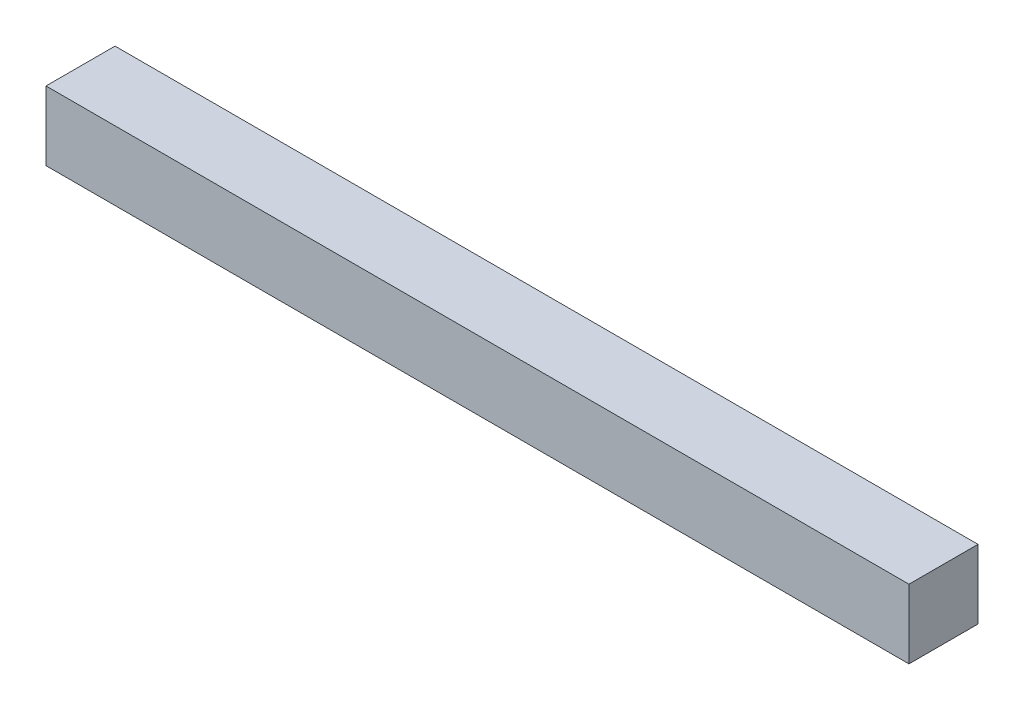
ISO-10303-21;
HEADER;
FILE_DESCRIPTION(('STEP AP214'),'2;1');
FILE_NAME('part.step','',(''),(''),'','','');
FILE_SCHEMA(('AUTOMOTIVE_DESIGN { 1 0 10303 214 1 1 1 1 }'));
ENDSEC;
DATA;
#1=APPLICATION_CONTEXT('core data for automotive mechanical design processes');
#2=APPLICATION_PROTOCOL_DEFINITION('international standard','automotive_design',2000,#1);
#3=PRODUCT_CONTEXT('',#1,'mechanical');
#4=PRODUCT('Part','Part','',(#3));
#5=PRODUCT_RELATED_PRODUCT_CATEGORY('part','',(#4));
#6=PRODUCT_DEFINITION_FORMATION('','',#4);
#7=PRODUCT_DEFINITION_CONTEXT('part definition',#1,'design');
#8=PRODUCT_DEFINITION('design','',#6,#7);
#9=PRODUCT_DEFINITION_SHAPE('','',#8);
#10=(LENGTH_UNIT() NAMED_UNIT(*) SI_UNIT(.MILLI.,.METRE.));
#11=(NAMED_UNIT(*) PLANE_ANGLE_UNIT() SI_UNIT($,.RADIAN.));
#12=(NAMED_UNIT(*) SI_UNIT($,.STERADIAN.) SOLID_ANGLE_UNIT());
#13=UNCERTAINTY_MEASURE_WITH_UNIT(LENGTH_MEASURE(1.E-05),#10,'distance_accuracy_value','');
#14=(GEOMETRIC_REPRESENTATION_CONTEXT(3) GLOBAL_UNCERTAINTY_ASSIGNED_CONTEXT((#13)) GLOBAL_UNIT_ASSIGNED_CONTEXT((#10,
#11,#12)) REPRESENTATION_CONTEXT('',''));
#15=CARTESIAN_POINT('',(0.,0.,0.));
#16=DIRECTION('',(0.,0.,1.));
#17=DIRECTION('',(1.,0.,0.));
#18=AXIS2_PLACEMENT_3D('',#15,#16,#17);
#19=CARTESIAN_POINT('',(0.,0.,16.));
#20=DIRECTION('',(1.,0.,0.));
#21=DIRECTION('',(0.,0.,-1.));
#22=AXIS2_PLACEMENT_3D('',#19,#20,#21);
#23=PLANE('',#22);
#24=DIRECTION('',(0.,-1.,0.));
#25=VECTOR('',#24,1.);
#26=CARTESIAN_POINT('',(0.,0.,0.));
#27=LINE('',#26,#25);
#28=CARTESIAN_POINT('',(0.,16.,0.));
#29=VERTEX_POINT('',#28);
#30=CARTESIAN_POINT('',(0.,0.,0.));
#31=VERTEX_POINT('',#30);
#32=EDGE_CURVE('E96',#29,#31,#27,.T.);
#33=ORIENTED_EDGE('',*,*,#32,.T.);
#34=DIRECTION('',(0.,0.,-1.));
#35=VECTOR('',#34,1.);
#36=CARTESIAN_POINT('',(0.,0.,16.));
#37=LINE('',#36,#35);
#38=CARTESIAN_POINT('',(0.,0.,16.));
#39=VERTEX_POINT('',#38);
#40=EDGE_CURVE('E11',#39,#31,#37,.T.);
#41=ORIENTED_EDGE('',*,*,#40,.F.);
#42=DIRECTION('',(0.,-1.,0.));
#43=VECTOR('',#42,1.);
#44=CARTESIAN_POINT('',(0.,0.,16.));
#45=LINE('',#44,#43);
#46=CARTESIAN_POINT('',(0.,16.,16.));
#47=VERTEX_POINT('',#46);
#48=EDGE_CURVE('E84',#47,#39,#45,.T.);
#49=ORIENTED_EDGE('',*,*,#48,.F.);
#50=DIRECTION('',(0.,0.,-1.));
#51=VECTOR('',#50,1.);
#52=CARTESIAN_POINT('',(0.,16.,16.));
#53=LINE('',#52,#51);
#54=EDGE_CURVE('E92',#47,#29,#53,.T.);
#55=ORIENTED_EDGE('',*,*,#54,.T.);
#56=EDGE_LOOP('',(#33,#41,#49,#55));
#57=FACE_BOUND('',#56,.T.);
#58=ADVANCED_FACE('F33',(#57),#23,.F.);
#59=CARTESIAN_POINT('',(0.,0.,16.));
#60=DIRECTION('',(0.,1.,0.));
#61=DIRECTION('',(0.,0.,1.));
#62=AXIS2_PLACEMENT_3D('',#59,#60,#61);
#63=PLANE('',#62);
#64=DIRECTION('',(1.,0.,0.));
#65=VECTOR('',#64,1.);
#66=CARTESIAN_POINT('',(0.,0.,0.));
#67=LINE('',#66,#65);
#68=CARTESIAN_POINT('',(200.,0.,0.));
#69=VERTEX_POINT('',#68);
#70=EDGE_CURVE('E88',#31,#69,#67,.T.);
#71=ORIENTED_EDGE('',*,*,#70,.T.);
#72=DIRECTION('',(0.,0.,-1.));
#73=VECTOR('',#72,1.);
#74=CARTESIAN_POINT('',(200.,0.,16.));
#75=LINE('',#74,#73);
#76=CARTESIAN_POINT('',(200.,0.,16.));
#77=VERTEX_POINT('',#76);
#78=EDGE_CURVE('E41',#77,#69,#75,.T.);
#79=ORIENTED_EDGE('',*,*,#78,.F.);
#80=DIRECTION('',(1.,0.,0.));
#81=VECTOR('',#80,1.);
#82=CARTESIAN_POINT('',(0.,0.,16.));
#83=LINE('',#82,#81);
#84=EDGE_CURVE('E79',#39,#77,#83,.T.);
#85=ORIENTED_EDGE('',*,*,#84,.F.);
#86=ORIENTED_EDGE('',*,*,#40,.T.);
#87=EDGE_LOOP('',(#71,#79,#85,#86));
#88=FACE_BOUND('',#87,.T.);
#89=ADVANCED_FACE('F87',(#88),#63,.F.);
#90=CARTESIAN_POINT('',(200.,0.,16.));
#91=DIRECTION('',(-1.,0.,0.));
#92=DIRECTION('',(0.,0.,1.));
#93=AXIS2_PLACEMENT_3D('',#90,#91,#92);
#94=PLANE('',#93);
#95=DIRECTION('',(0.,1.,0.));
#96=VECTOR('',#95,1.);
#97=CARTESIAN_POINT('',(200.,0.,0.));
#98=LINE('',#97,#96);
#99=CARTESIAN_POINT('',(200.,16.,0.));
#100=VERTEX_POINT('',#99);
#101=EDGE_CURVE('E66',#69,#100,#98,.T.);
#102=ORIENTED_EDGE('',*,*,#101,.T.);
#103=DIRECTION('',(0.,0.,-1.));
#104=VECTOR('',#103,1.);
#105=CARTESIAN_POINT('',(200.,16.,16.));
#106=LINE('',#105,#104);
#107=CARTESIAN_POINT('',(200.,16.,16.));
#108=VERTEX_POINT('',#107);
#109=EDGE_CURVE('E89',#108,#100,#106,.T.);
#110=ORIENTED_EDGE('',*,*,#109,.F.);
#111=DIRECTION('',(0.,1.,0.));
#112=VECTOR('',#111,1.);
#113=CARTESIAN_POINT('',(200.,0.,16.));
#114=LINE('',#113,#112);
#115=EDGE_CURVE('E82',#77,#108,#114,.T.);
#116=ORIENTED_EDGE('',*,*,#115,.F.);
#117=ORIENTED_EDGE('',*,*,#78,.T.);
#118=EDGE_LOOP('',(#102,#110,#116,#117));
#119=FACE_BOUND('',#118,.T.);
#120=ADVANCED_FACE('F90',(#119),#94,.F.);
#121=CARTESIAN_POINT('',(0.,16.,16.));
#122=DIRECTION('',(0.,-1.,0.));
#123=DIRECTION('',(0.,0.,-1.));
#124=AXIS2_PLACEMENT_3D('',#121,#122,#123);
#125=PLANE('',#124);
#126=DIRECTION('',(-1.,0.,0.));
#127=VECTOR('',#126,1.);
#128=CARTESIAN_POINT('',(0.,16.,0.));
#129=LINE('',#128,#127);
#130=EDGE_CURVE('E72',#100,#29,#129,.T.);
#131=ORIENTED_EDGE('',*,*,#130,.T.);
#132=ORIENTED_EDGE('',*,*,#54,.F.);
#133=DIRECTION('',(-1.,0.,0.));
#134=VECTOR('',#133,1.);
#135=CARTESIAN_POINT('',(0.,16.,16.));
#136=LINE('',#135,#134);
#137=EDGE_CURVE('E49',#108,#47,#136,.T.);
#138=ORIENTED_EDGE('',*,*,#137,.F.);
#139=ORIENTED_EDGE('',*,*,#109,.T.);
#140=EDGE_LOOP('',(#131,#132,#138,#139));
#141=FACE_BOUND('',#140,.T.);
#142=ADVANCED_FACE('F103',(#141),#125,.F.);
#143=CARTESIAN_POINT('',(0.,0.,16.));
#144=DIRECTION('',(0.,0.,-1.));
#145=DIRECTION('',(-1.,0.,0.));
#146=AXIS2_PLACEMENT_3D('',#143,#144,#145);
#147=PLANE('',#146);
#148=ORIENTED_EDGE('',*,*,#48,.T.);
#149=ORIENTED_EDGE('',*,*,#84,.T.);
#150=ORIENTED_EDGE('',*,*,#115,.T.);
#151=ORIENTED_EDGE('',*,*,#137,.T.);
#152=EDGE_LOOP('',(#148,#149,#150,#151));
#153=FACE_BOUND('',#152,.T.);
#154=ADVANCED_FACE('F80',(#153),#147,.F.);
#155=CARTESIAN_POINT('',(0.,0.,0.));
#156=DIRECTION('',(0.,0.,-1.));
#157=DIRECTION('',(-1.,0.,0.));
#158=AXIS2_PLACEMENT_3D('',#155,#156,#157);
#159=PLANE('',#158);
#160=ORIENTED_EDGE('',*,*,#32,.F.);
#161=ORIENTED_EDGE('',*,*,#130,.F.);
#162=ORIENTED_EDGE('',*,*,#101,.F.);
#163=ORIENTED_EDGE('',*,*,#70,.F.);
#164=EDGE_LOOP('',(#160,#161,#162,#163));
#165=FACE_BOUND('',#164,.T.);
#166=ADVANCED_FACE('F106',(#165),#159,.T.);
#167=CLOSED_SHELL('',(#58,#89,#120,#142,#154,#166));
#168=MANIFOLD_SOLID_BREP('B2',#167);
#169=ADVANCED_BREP_SHAPE_REPRESENTATION('',(#18,#168),#14);
#170=SHAPE_DEFINITION_REPRESENTATION(#9,#169);
ENDSEC;
END-ISO-10303-21;
